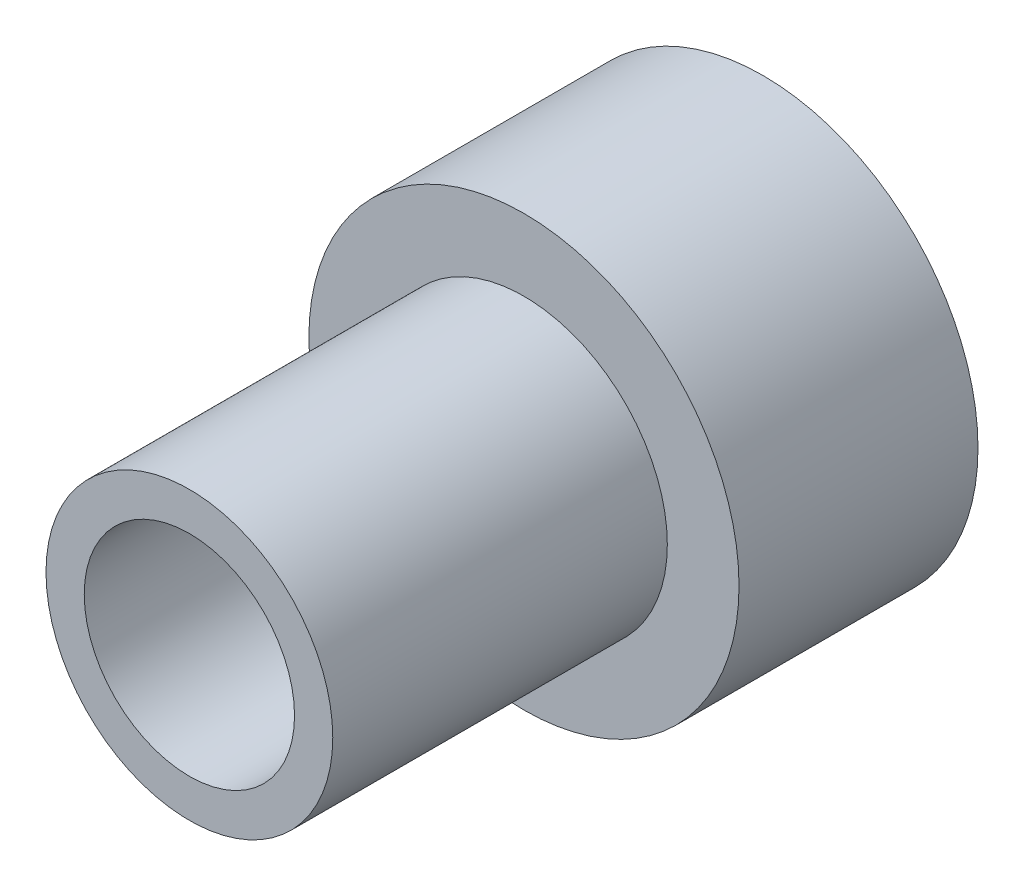
ISO-10303-21;
HEADER;
FILE_DESCRIPTION(('STEP AP214'),'2;1');
FILE_NAME('part.step','',(''),(''),'','','');
FILE_SCHEMA(('AUTOMOTIVE_DESIGN { 1 0 10303 214 1 1 1 1 }'));
ENDSEC;
DATA;
#1=APPLICATION_CONTEXT('core data for automotive mechanical design processes');
#2=APPLICATION_PROTOCOL_DEFINITION('international standard','automotive_design',2000,#1);
#3=PRODUCT_CONTEXT('',#1,'mechanical');
#4=PRODUCT('Part','Part','',(#3));
#5=PRODUCT_RELATED_PRODUCT_CATEGORY('part','',(#4));
#6=PRODUCT_DEFINITION_FORMATION('','',#4);
#7=PRODUCT_DEFINITION_CONTEXT('part definition',#1,'design');
#8=PRODUCT_DEFINITION('design','',#6,#7);
#9=PRODUCT_DEFINITION_SHAPE('','',#8);
#10=(LENGTH_UNIT() NAMED_UNIT(*) SI_UNIT(.MILLI.,.METRE.));
#11=(NAMED_UNIT(*) PLANE_ANGLE_UNIT() SI_UNIT($,.RADIAN.));
#12=(NAMED_UNIT(*) SI_UNIT($,.STERADIAN.) SOLID_ANGLE_UNIT());
#13=UNCERTAINTY_MEASURE_WITH_UNIT(LENGTH_MEASURE(1.E-05),#10,'distance_accuracy_value','');
#14=(GEOMETRIC_REPRESENTATION_CONTEXT(3) GLOBAL_UNCERTAINTY_ASSIGNED_CONTEXT((#13)) GLOBAL_UNIT_ASSIGNED_CONTEXT((#10,
#11,#12)) REPRESENTATION_CONTEXT('',''));
#15=CARTESIAN_POINT('',(0.,0.,0.));
#16=DIRECTION('',(0.,0.,1.));
#17=DIRECTION('',(1.,0.,0.));
#18=AXIS2_PLACEMENT_3D('',#15,#16,#17);
#19=CARTESIAN_POINT('',(-1.5,0.,-3.5));
#20=DIRECTION('',(0.,0.,-1.));
#21=DIRECTION('',(-1.,0.,0.));
#22=AXIS2_PLACEMENT_3D('',#19,#20,#21);
#23=PLANE('',#22);
#24=CARTESIAN_POINT('',(0.,0.,-3.5));
#25=DIRECTION('',(0.,0.,1.));
#26=DIRECTION('',(1.,0.,0.));
#27=AXIS2_PLACEMENT_3D('',#24,#25,#26);
#28=CIRCLE('',#27,1.5);
#29=CARTESIAN_POINT('',(1.5,0.,-3.5));
#30=VERTEX_POINT('',#29);
#31=EDGE_CURVE('E78',#30,#30,#28,.T.);
#32=ORIENTED_EDGE('',*,*,#31,.F.);
#33=EDGE_LOOP('',(#32));
#34=FACE_BOUND('',#33,.T.);
#35=CARTESIAN_POINT('',(0.,0.,-3.5));
#36=DIRECTION('',(0.,0.,1.));
#37=DIRECTION('',(1.,0.,0.));
#38=AXIS2_PLACEMENT_3D('',#35,#36,#37);
#39=CIRCLE('',#38,2.25);
#40=CARTESIAN_POINT('',(2.25,0.,-3.5));
#41=VERTEX_POINT('',#40);
#42=EDGE_CURVE('E10',#41,#41,#39,.T.);
#43=ORIENTED_EDGE('',*,*,#42,.T.);
#44=EDGE_LOOP('',(#43));
#45=FACE_BOUND('',#44,.T.);
#46=ADVANCED_FACE('F43',(#34,#45),#23,.F.);
#47=CARTESIAN_POINT('',(0.,0.,0.));
#48=DIRECTION('',(0.,0.,1.));
#49=DIRECTION('',(1.,0.,0.));
#50=AXIS2_PLACEMENT_3D('',#47,#48,#49);
#51=CYLINDRICAL_SURFACE('',#50,2.25);
#52=ORIENTED_EDGE('',*,*,#42,.F.);
#53=EDGE_LOOP('',(#52));
#54=FACE_BOUND('',#53,.T.);
#55=CARTESIAN_POINT('',(0.,0.,-6.));
#56=DIRECTION('',(0.,0.,1.));
#57=DIRECTION('',(1.,0.,0.));
#58=AXIS2_PLACEMENT_3D('',#55,#56,#57);
#59=CIRCLE('',#58,2.25);
#60=CARTESIAN_POINT('',(2.25,0.,-6.));
#61=VERTEX_POINT('',#60);
#62=EDGE_CURVE('E50',#61,#61,#59,.T.);
#63=ORIENTED_EDGE('',*,*,#62,.T.);
#64=EDGE_LOOP('',(#63));
#65=FACE_BOUND('',#64,.T.);
#66=ADVANCED_FACE('F86',(#54,#65),#51,.T.);
#67=CARTESIAN_POINT('',(-2.25,0.,-6.));
#68=DIRECTION('',(0.,0.,1.));
#69=DIRECTION('',(1.,0.,0.));
#70=AXIS2_PLACEMENT_3D('',#67,#68,#69);
#71=PLANE('',#70);
#72=ORIENTED_EDGE('',*,*,#62,.F.);
#73=EDGE_LOOP('',(#72));
#74=FACE_BOUND('',#73,.T.);
#75=CARTESIAN_POINT('',(0.,0.,-6.));
#76=DIRECTION('',(0.,0.,1.));
#77=DIRECTION('',(1.,0.,0.));
#78=AXIS2_PLACEMENT_3D('',#75,#76,#77);
#79=CIRCLE('',#78,1.9);
#80=CARTESIAN_POINT('',(1.9,0.,-6.));
#81=VERTEX_POINT('',#80);
#82=EDGE_CURVE('E55',#81,#81,#79,.T.);
#83=ORIENTED_EDGE('',*,*,#82,.T.);
#84=EDGE_LOOP('',(#83));
#85=FACE_BOUND('',#84,.T.);
#86=ADVANCED_FACE('F90',(#74,#85),#71,.F.);
#87=CARTESIAN_POINT('',(0.,0.,0.));
#88=DIRECTION('',(0.,0.,1.));
#89=DIRECTION('',(1.,0.,0.));
#90=AXIS2_PLACEMENT_3D('',#87,#88,#89);
#91=CYLINDRICAL_SURFACE('',#90,1.9);
#92=ORIENTED_EDGE('',*,*,#82,.F.);
#93=EDGE_LOOP('',(#92));
#94=FACE_BOUND('',#93,.T.);
#95=CARTESIAN_POINT('',(0.,0.,-4.5));
#96=DIRECTION('',(0.,0.,1.));
#97=DIRECTION('',(1.,0.,0.));
#98=AXIS2_PLACEMENT_3D('',#95,#96,#97);
#99=CIRCLE('',#98,1.9);
#100=CARTESIAN_POINT('',(1.9,0.,-4.5));
#101=VERTEX_POINT('',#100);
#102=EDGE_CURVE('E60',#101,#101,#99,.T.);
#103=ORIENTED_EDGE('',*,*,#102,.T.);
#104=EDGE_LOOP('',(#103));
#105=FACE_BOUND('',#104,.T.);
#106=ADVANCED_FACE('F95',(#94,#105),#91,.F.);
#107=CARTESIAN_POINT('',(-1.9,0.,-4.5));
#108=DIRECTION('',(0.,0.,1.));
#109=DIRECTION('',(1.,0.,0.));
#110=AXIS2_PLACEMENT_3D('',#107,#108,#109);
#111=PLANE('',#110);
#112=ORIENTED_EDGE('',*,*,#102,.F.);
#113=EDGE_LOOP('',(#112));
#114=FACE_BOUND('',#113,.T.);
#115=CARTESIAN_POINT('',(0.,0.,-4.5));
#116=DIRECTION('',(0.,0.,1.));
#117=DIRECTION('',(1.,0.,0.));
#118=AXIS2_PLACEMENT_3D('',#115,#116,#117);
#119=CIRCLE('',#118,1.1);
#120=CARTESIAN_POINT('',(1.1,0.,-4.5));
#121=VERTEX_POINT('',#120);
#122=EDGE_CURVE('E66',#121,#121,#119,.T.);
#123=ORIENTED_EDGE('',*,*,#122,.T.);
#124=EDGE_LOOP('',(#123));
#125=FACE_BOUND('',#124,.T.);
#126=ADVANCED_FACE('F101',(#114,#125),#111,.F.);
#127=CARTESIAN_POINT('',(0.,0.,0.));
#128=DIRECTION('',(0.,0.,1.));
#129=DIRECTION('',(1.,0.,0.));
#130=AXIS2_PLACEMENT_3D('',#127,#128,#129);
#131=CYLINDRICAL_SURFACE('',#130,1.1);
#132=ORIENTED_EDGE('',*,*,#122,.F.);
#133=EDGE_LOOP('',(#132));
#134=FACE_BOUND('',#133,.T.);
#135=CARTESIAN_POINT('',(0.,0.,0.));
#136=DIRECTION('',(0.,0.,1.));
#137=DIRECTION('',(1.,0.,0.));
#138=AXIS2_PLACEMENT_3D('',#135,#136,#137);
#139=CIRCLE('',#138,1.1);
#140=CARTESIAN_POINT('',(1.1,0.,0.));
#141=VERTEX_POINT('',#140);
#142=EDGE_CURVE('E70',#141,#141,#139,.T.);
#143=ORIENTED_EDGE('',*,*,#142,.T.);
#144=EDGE_LOOP('',(#143));
#145=FACE_BOUND('',#144,.T.);
#146=ADVANCED_FACE('F105',(#134,#145),#131,.F.);
#147=CARTESIAN_POINT('',(-1.1,0.,0.));
#148=DIRECTION('',(0.,0.,-1.));
#149=DIRECTION('',(-1.,0.,0.));
#150=AXIS2_PLACEMENT_3D('',#147,#148,#149);
#151=PLANE('',#150);
#152=ORIENTED_EDGE('',*,*,#142,.F.);
#153=EDGE_LOOP('',(#152));
#154=FACE_BOUND('',#153,.T.);
#155=CARTESIAN_POINT('',(0.,0.,0.));
#156=DIRECTION('',(0.,0.,1.));
#157=DIRECTION('',(1.,0.,0.));
#158=AXIS2_PLACEMENT_3D('',#155,#156,#157);
#159=CIRCLE('',#158,1.5);
#160=CARTESIAN_POINT('',(1.5,0.,0.));
#161=VERTEX_POINT('',#160);
#162=EDGE_CURVE('E74',#161,#161,#159,.T.);
#163=ORIENTED_EDGE('',*,*,#162,.T.);
#164=EDGE_LOOP('',(#163));
#165=FACE_BOUND('',#164,.T.);
#166=ADVANCED_FACE('F109',(#154,#165),#151,.F.);
#167=CARTESIAN_POINT('',(0.,0.,0.));
#168=DIRECTION('',(0.,0.,1.));
#169=DIRECTION('',(1.,0.,0.));
#170=AXIS2_PLACEMENT_3D('',#167,#168,#169);
#171=CYLINDRICAL_SURFACE('',#170,1.5);
#172=ORIENTED_EDGE('',*,*,#162,.F.);
#173=EDGE_LOOP('',(#172));
#174=FACE_BOUND('',#173,.T.);
#175=ORIENTED_EDGE('',*,*,#31,.T.);
#176=EDGE_LOOP('',(#175));
#177=FACE_BOUND('',#176,.T.);
#178=ADVANCED_FACE('F83',(#174,#177),#171,.T.);
#179=CLOSED_SHELL('',(#46,#66,#86,#106,#126,#146,#166,#178));
#180=MANIFOLD_SOLID_BREP('B2',#179);
#181=ADVANCED_BREP_SHAPE_REPRESENTATION('',(#18,#180),#14);
#182=SHAPE_DEFINITION_REPRESENTATION(#9,#181);
ENDSEC;
END-ISO-10303-21;
